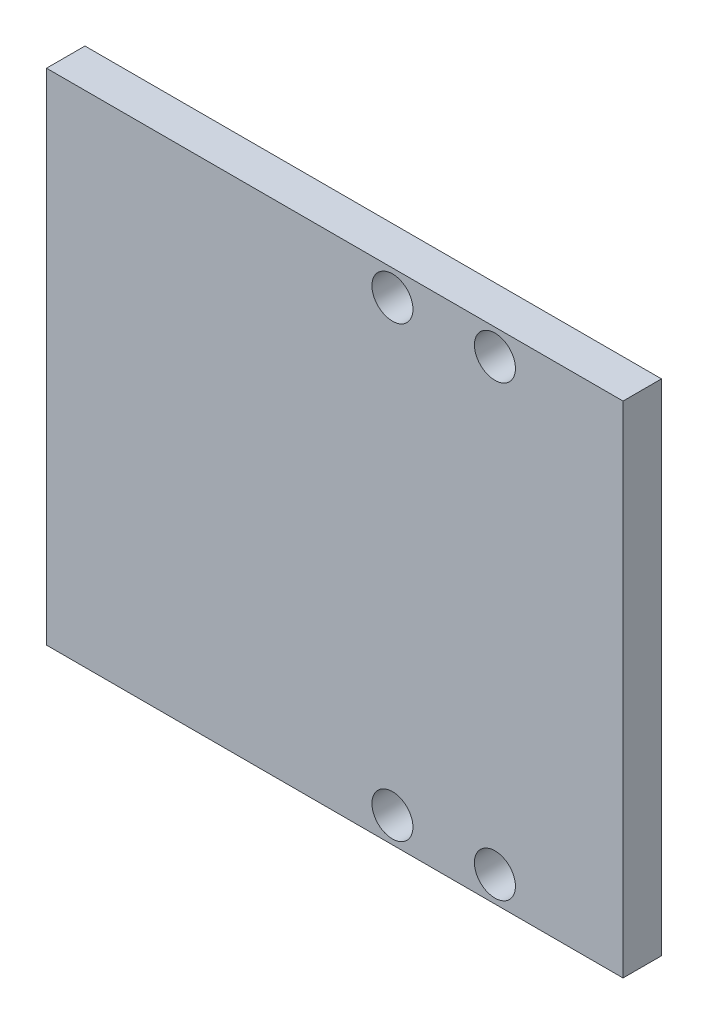
ISO-10303-21;
HEADER;
FILE_DESCRIPTION(('STEP AP214'),'2;1');
FILE_NAME('part.step','',(''),(''),'','','');
FILE_SCHEMA(('AUTOMOTIVE_DESIGN { 1 0 10303 214 1 1 1 1 }'));
ENDSEC;
DATA;
#1=APPLICATION_CONTEXT('core data for automotive mechanical design processes');
#2=APPLICATION_PROTOCOL_DEFINITION('international standard','automotive_design',2000,#1);
#3=PRODUCT_CONTEXT('',#1,'mechanical');
#4=PRODUCT('Part','Part','',(#3));
#5=PRODUCT_RELATED_PRODUCT_CATEGORY('part','',(#4));
#6=PRODUCT_DEFINITION_FORMATION('','',#4);
#7=PRODUCT_DEFINITION_CONTEXT('part definition',#1,'design');
#8=PRODUCT_DEFINITION('design','',#6,#7);
#9=PRODUCT_DEFINITION_SHAPE('','',#8);
#10=(LENGTH_UNIT() NAMED_UNIT(*) SI_UNIT(.MILLI.,.METRE.));
#11=(NAMED_UNIT(*) PLANE_ANGLE_UNIT() SI_UNIT($,.RADIAN.));
#12=(NAMED_UNIT(*) SI_UNIT($,.STERADIAN.) SOLID_ANGLE_UNIT());
#13=UNCERTAINTY_MEASURE_WITH_UNIT(LENGTH_MEASURE(1.E-05),#10,'distance_accuracy_value','');
#14=(GEOMETRIC_REPRESENTATION_CONTEXT(3) GLOBAL_UNCERTAINTY_ASSIGNED_CONTEXT((#13)) GLOBAL_UNIT_ASSIGNED_CONTEXT((#10,
#11,#12)) REPRESENTATION_CONTEXT('',''));
#15=CARTESIAN_POINT('',(0.,0.,0.));
#16=DIRECTION('',(0.,0.,1.));
#17=DIRECTION('',(1.,0.,0.));
#18=AXIS2_PLACEMENT_3D('',#15,#16,#17);
#19=CARTESIAN_POINT('',(0.,0.,3.));
#20=DIRECTION('',(0.,0.,-1.));
#21=DIRECTION('',(-1.,0.,0.));
#22=AXIS2_PLACEMENT_3D('',#19,#20,#21);
#23=PLANE('',#22);
#24=DIRECTION('',(0.,1.,0.));
#25=VECTOR('',#24,1.);
#26=CARTESIAN_POINT('',(70.,20.7624683604831,3.));
#27=LINE('',#26,#25);
#28=CARTESIAN_POINT('',(70.,-18.237468360532,3.));
#29=VERTEX_POINT('',#28);
#30=CARTESIAN_POINT('',(70.,20.7624683604831,3.));
#31=VERTEX_POINT('',#30);
#32=EDGE_CURVE('E87',#29,#31,#27,.T.);
#33=ORIENTED_EDGE('',*,*,#32,.T.);
#34=DIRECTION('',(-1.,0.,0.));
#35=VECTOR('',#34,1.);
#36=CARTESIAN_POINT('',(70.,20.7624683604831,3.));
#37=LINE('',#36,#35);
#38=CARTESIAN_POINT('',(25.,20.7624683604831,3.));
#39=VERTEX_POINT('',#38);
#40=EDGE_CURVE('E82',#31,#39,#37,.T.);
#41=ORIENTED_EDGE('',*,*,#40,.T.);
#42=DIRECTION('',(0.,-1.,0.));
#43=VECTOR('',#42,1.);
#44=CARTESIAN_POINT('',(25.,20.7624683604831,3.));
#45=LINE('',#44,#43);
#46=CARTESIAN_POINT('',(25.0000000000001,-18.237468360532,3.));
#47=VERTEX_POINT('',#46);
#48=EDGE_CURVE('E85',#39,#47,#45,.T.);
#49=ORIENTED_EDGE('',*,*,#48,.T.);
#50=DIRECTION('',(1.,0.,0.));
#51=VECTOR('',#50,1.);
#52=CARTESIAN_POINT('',(70.,-18.237468360532,3.));
#53=LINE('',#52,#51);
#54=EDGE_CURVE('E52',#47,#29,#53,.T.);
#55=ORIENTED_EDGE('',*,*,#54,.T.);
#56=EDGE_LOOP('',(#33,#41,#49,#55));
#57=FACE_BOUND('',#56,.T.);
#58=CARTESIAN_POINT('',(60.,18.7624683604831,3.));
#59=DIRECTION('',(0.,0.,1.));
#60=DIRECTION('',(1.,0.,0.));
#61=AXIS2_PLACEMENT_3D('',#58,#59,#60);
#62=CIRCLE('',#61,1.6);
#63=CARTESIAN_POINT('',(61.6,18.7624683604831,3.));
#64=VERTEX_POINT('',#63);
#65=EDGE_CURVE('E102',#64,#64,#62,.T.);
#66=ORIENTED_EDGE('',*,*,#65,.F.);
#67=EDGE_LOOP('',(#66));
#68=FACE_BOUND('',#67,.T.);
#69=CARTESIAN_POINT('',(52.,18.7624683604831,3.));
#70=DIRECTION('',(0.,0.,1.));
#71=DIRECTION('',(1.,0.,0.));
#72=AXIS2_PLACEMENT_3D('',#69,#70,#71);
#73=CIRCLE('',#72,1.6);
#74=CARTESIAN_POINT('',(53.6,18.7624683604831,3.));
#75=VERTEX_POINT('',#74);
#76=EDGE_CURVE('E117',#75,#75,#73,.T.);
#77=ORIENTED_EDGE('',*,*,#76,.F.);
#78=EDGE_LOOP('',(#77));
#79=FACE_BOUND('',#78,.T.);
#80=CARTESIAN_POINT('',(60.,-16.237468360532,3.));
#81=DIRECTION('',(0.,0.,1.));
#82=DIRECTION('',(1.,0.,0.));
#83=AXIS2_PLACEMENT_3D('',#80,#81,#82);
#84=CIRCLE('',#83,1.6);
#85=CARTESIAN_POINT('',(61.6,-16.237468360532,3.));
#86=VERTEX_POINT('',#85);
#87=EDGE_CURVE('E123',#86,#86,#84,.T.);
#88=ORIENTED_EDGE('',*,*,#87,.F.);
#89=EDGE_LOOP('',(#88));
#90=FACE_BOUND('',#89,.T.);
#91=CARTESIAN_POINT('',(52.,-16.237468360532,3.));
#92=DIRECTION('',(0.,0.,1.));
#93=DIRECTION('',(1.,0.,0.));
#94=AXIS2_PLACEMENT_3D('',#91,#92,#93);
#95=CIRCLE('',#94,1.6);
#96=CARTESIAN_POINT('',(53.6,-16.237468360532,3.));
#97=VERTEX_POINT('',#96);
#98=EDGE_CURVE('E129',#97,#97,#95,.T.);
#99=ORIENTED_EDGE('',*,*,#98,.F.);
#100=EDGE_LOOP('',(#99));
#101=FACE_BOUND('',#100,.T.);
#102=ADVANCED_FACE('F35',(#57,#68,#79,#90,#101),#23,.F.);
#103=CARTESIAN_POINT('',(0.,0.,0.));
#104=DIRECTION('',(0.,0.,-1.));
#105=DIRECTION('',(-1.,0.,0.));
#106=AXIS2_PLACEMENT_3D('',#103,#104,#105);
#107=PLANE('',#106);
#108=CARTESIAN_POINT('',(60.,-16.237468360532,0.));
#109=DIRECTION('',(0.,0.,1.));
#110=DIRECTION('',(1.,0.,0.));
#111=AXIS2_PLACEMENT_3D('',#108,#109,#110);
#112=CIRCLE('',#111,1.6);
#113=CARTESIAN_POINT('',(61.6,-16.237468360532,0.));
#114=VERTEX_POINT('',#113);
#115=EDGE_CURVE('E126',#114,#114,#112,.T.);
#116=ORIENTED_EDGE('',*,*,#115,.T.);
#117=EDGE_LOOP('',(#116));
#118=FACE_BOUND('',#117,.T.);
#119=CARTESIAN_POINT('',(60.,18.7624683604831,0.));
#120=DIRECTION('',(0.,0.,1.));
#121=DIRECTION('',(1.,0.,0.));
#122=AXIS2_PLACEMENT_3D('',#119,#120,#121);
#123=CIRCLE('',#122,1.6);
#124=CARTESIAN_POINT('',(61.6,18.7624683604831,0.));
#125=VERTEX_POINT('',#124);
#126=EDGE_CURVE('E114',#125,#125,#123,.T.);
#127=ORIENTED_EDGE('',*,*,#126,.T.);
#128=EDGE_LOOP('',(#127));
#129=FACE_BOUND('',#128,.T.);
#130=DIRECTION('',(0.,1.,0.));
#131=VECTOR('',#130,1.);
#132=CARTESIAN_POINT('',(70.,20.7624683604831,0.));
#133=LINE('',#132,#131);
#134=CARTESIAN_POINT('',(70.,-18.237468360532,0.));
#135=VERTEX_POINT('',#134);
#136=CARTESIAN_POINT('',(70.,20.7624683604831,0.));
#137=VERTEX_POINT('',#136);
#138=EDGE_CURVE('E99',#135,#137,#133,.T.);
#139=ORIENTED_EDGE('',*,*,#138,.F.);
#140=DIRECTION('',(1.,0.,0.));
#141=VECTOR('',#140,1.);
#142=CARTESIAN_POINT('',(70.,-18.237468360532,0.));
#143=LINE('',#142,#141);
#144=CARTESIAN_POINT('',(25.0000000000001,-18.237468360532,0.));
#145=VERTEX_POINT('',#144);
#146=EDGE_CURVE('E75',#145,#135,#143,.T.);
#147=ORIENTED_EDGE('',*,*,#146,.F.);
#148=DIRECTION('',(0.,-1.,0.));
#149=VECTOR('',#148,1.);
#150=CARTESIAN_POINT('',(25.,20.7624683604831,0.));
#151=LINE('',#150,#149);
#152=CARTESIAN_POINT('',(25.,20.7624683604831,0.));
#153=VERTEX_POINT('',#152);
#154=EDGE_CURVE('E69',#153,#145,#151,.T.);
#155=ORIENTED_EDGE('',*,*,#154,.F.);
#156=DIRECTION('',(-1.,0.,0.));
#157=VECTOR('',#156,1.);
#158=CARTESIAN_POINT('',(70.,20.7624683604831,0.));
#159=LINE('',#158,#157);
#160=EDGE_CURVE('E91',#137,#153,#159,.T.);
#161=ORIENTED_EDGE('',*,*,#160,.F.);
#162=EDGE_LOOP('',(#139,#147,#155,#161));
#163=FACE_BOUND('',#162,.T.);
#164=CARTESIAN_POINT('',(52.,18.7624683604831,0.));
#165=DIRECTION('',(0.,0.,1.));
#166=DIRECTION('',(1.,0.,0.));
#167=AXIS2_PLACEMENT_3D('',#164,#165,#166);
#168=CIRCLE('',#167,1.6);
#169=CARTESIAN_POINT('',(53.6,18.7624683604831,0.));
#170=VERTEX_POINT('',#169);
#171=EDGE_CURVE('E120',#170,#170,#168,.T.);
#172=ORIENTED_EDGE('',*,*,#171,.T.);
#173=EDGE_LOOP('',(#172));
#174=FACE_BOUND('',#173,.T.);
#175=CARTESIAN_POINT('',(52.,-16.237468360532,0.));
#176=DIRECTION('',(0.,0.,1.));
#177=DIRECTION('',(1.,0.,0.));
#178=AXIS2_PLACEMENT_3D('',#175,#176,#177);
#179=CIRCLE('',#178,1.6);
#180=CARTESIAN_POINT('',(53.6,-16.237468360532,0.));
#181=VERTEX_POINT('',#180);
#182=EDGE_CURVE('E132',#181,#181,#179,.T.);
#183=ORIENTED_EDGE('',*,*,#182,.T.);
#184=EDGE_LOOP('',(#183));
#185=FACE_BOUND('',#184,.T.);
#186=ADVANCED_FACE('F110',(#118,#129,#163,#174,#185),#107,.T.);
#187=CARTESIAN_POINT('',(70.,20.7624683604831,3.));
#188=DIRECTION('',(-1.,0.,0.));
#189=DIRECTION('',(0.,0.,1.));
#190=AXIS2_PLACEMENT_3D('',#187,#188,#189);
#191=PLANE('',#190);
#192=ORIENTED_EDGE('',*,*,#138,.T.);
#193=DIRECTION('',(0.,0.,-1.));
#194=VECTOR('',#193,1.);
#195=CARTESIAN_POINT('',(70.,20.7624683604831,3.));
#196=LINE('',#195,#194);
#197=EDGE_CURVE('E11',#31,#137,#196,.T.);
#198=ORIENTED_EDGE('',*,*,#197,.F.);
#199=ORIENTED_EDGE('',*,*,#32,.F.);
#200=DIRECTION('',(0.,0.,-1.));
#201=VECTOR('',#200,1.);
#202=CARTESIAN_POINT('',(70.,-18.237468360532,3.));
#203=LINE('',#202,#201);
#204=EDGE_CURVE('E95',#29,#135,#203,.T.);
#205=ORIENTED_EDGE('',*,*,#204,.T.);
#206=EDGE_LOOP('',(#192,#198,#199,#205));
#207=FACE_BOUND('',#206,.T.);
#208=ADVANCED_FACE('F37',(#207),#191,.F.);
#209=CARTESIAN_POINT('',(70.,20.7624683604831,3.));
#210=DIRECTION('',(0.,-1.,0.));
#211=DIRECTION('',(1.,0.,0.));
#212=AXIS2_PLACEMENT_3D('',#209,#210,#211);
#213=PLANE('',#212);
#214=ORIENTED_EDGE('',*,*,#160,.T.);
#215=DIRECTION('',(0.,0.,-1.));
#216=VECTOR('',#215,1.);
#217=CARTESIAN_POINT('',(25.,20.7624683604831,3.));
#218=LINE('',#217,#216);
#219=EDGE_CURVE('E44',#39,#153,#218,.T.);
#220=ORIENTED_EDGE('',*,*,#219,.F.);
#221=ORIENTED_EDGE('',*,*,#40,.F.);
#222=ORIENTED_EDGE('',*,*,#197,.T.);
#223=EDGE_LOOP('',(#214,#220,#221,#222));
#224=FACE_BOUND('',#223,.T.);
#225=ADVANCED_FACE('F90',(#224),#213,.F.);
#226=CARTESIAN_POINT('',(25.,20.7624683604831,3.));
#227=DIRECTION('',(1.,0.,0.));
#228=DIRECTION('',(0.,1.,0.));
#229=AXIS2_PLACEMENT_3D('',#226,#227,#228);
#230=PLANE('',#229);
#231=ORIENTED_EDGE('',*,*,#154,.T.);
#232=DIRECTION('',(0.,0.,-1.));
#233=VECTOR('',#232,1.);
#234=CARTESIAN_POINT('',(25.0000000000001,-18.237468360532,3.));
#235=LINE('',#234,#233);
#236=EDGE_CURVE('E92',#47,#145,#235,.T.);
#237=ORIENTED_EDGE('',*,*,#236,.F.);
#238=ORIENTED_EDGE('',*,*,#48,.F.);
#239=ORIENTED_EDGE('',*,*,#219,.T.);
#240=EDGE_LOOP('',(#231,#237,#238,#239));
#241=FACE_BOUND('',#240,.T.);
#242=ADVANCED_FACE('F93',(#241),#230,.F.);
#243=CARTESIAN_POINT('',(70.,-18.237468360532,3.));
#244=DIRECTION('',(0.,1.,0.));
#245=DIRECTION('',(-1.,0.,0.));
#246=AXIS2_PLACEMENT_3D('',#243,#244,#245);
#247=PLANE('',#246);
#248=ORIENTED_EDGE('',*,*,#146,.T.);
#249=ORIENTED_EDGE('',*,*,#204,.F.);
#250=ORIENTED_EDGE('',*,*,#54,.F.);
#251=ORIENTED_EDGE('',*,*,#236,.T.);
#252=EDGE_LOOP('',(#248,#249,#250,#251));
#253=FACE_BOUND('',#252,.T.);
#254=ADVANCED_FACE('F107',(#253),#247,.F.);
#255=CARTESIAN_POINT('',(60.,18.7624683604831,3.));
#256=DIRECTION('',(0.,0.,-1.));
#257=DIRECTION('',(-1.,0.,0.));
#258=AXIS2_PLACEMENT_3D('',#255,#256,#257);
#259=CYLINDRICAL_SURFACE('',#258,1.6);
#260=ORIENTED_EDGE('',*,*,#65,.T.);
#261=EDGE_LOOP('',(#260));
#262=FACE_BOUND('',#261,.T.);
#263=ORIENTED_EDGE('',*,*,#126,.F.);
#264=EDGE_LOOP('',(#263));
#265=FACE_BOUND('',#264,.T.);
#266=ADVANCED_FACE('F149',(#262,#265),#259,.F.);
#267=CARTESIAN_POINT('',(52.,18.7624683604831,3.));
#268=DIRECTION('',(0.,0.,-1.));
#269=DIRECTION('',(-1.,0.,0.));
#270=AXIS2_PLACEMENT_3D('',#267,#268,#269);
#271=CYLINDRICAL_SURFACE('',#270,1.6);
#272=ORIENTED_EDGE('',*,*,#76,.T.);
#273=EDGE_LOOP('',(#272));
#274=FACE_BOUND('',#273,.T.);
#275=ORIENTED_EDGE('',*,*,#171,.F.);
#276=EDGE_LOOP('',(#275));
#277=FACE_BOUND('',#276,.T.);
#278=ADVANCED_FACE('F195',(#274,#277),#271,.F.);
#279=CARTESIAN_POINT('',(60.,-16.237468360532,3.));
#280=DIRECTION('',(0.,0.,-1.));
#281=DIRECTION('',(-1.,0.,0.));
#282=AXIS2_PLACEMENT_3D('',#279,#280,#281);
#283=CYLINDRICAL_SURFACE('',#282,1.6);
#284=ORIENTED_EDGE('',*,*,#87,.T.);
#285=EDGE_LOOP('',(#284));
#286=FACE_BOUND('',#285,.T.);
#287=ORIENTED_EDGE('',*,*,#115,.F.);
#288=EDGE_LOOP('',(#287));
#289=FACE_BOUND('',#288,.T.);
#290=ADVANCED_FACE('F203',(#286,#289),#283,.F.);
#291=CARTESIAN_POINT('',(52.,-16.237468360532,3.));
#292=DIRECTION('',(0.,0.,-1.));
#293=DIRECTION('',(-1.,0.,0.));
#294=AXIS2_PLACEMENT_3D('',#291,#292,#293);
#295=CYLINDRICAL_SURFACE('',#294,1.6);
#296=ORIENTED_EDGE('',*,*,#98,.T.);
#297=EDGE_LOOP('',(#296));
#298=FACE_BOUND('',#297,.T.);
#299=ORIENTED_EDGE('',*,*,#182,.F.);
#300=EDGE_LOOP('',(#299));
#301=FACE_BOUND('',#300,.T.);
#302=ADVANCED_FACE('F138',(#298,#301),#295,.F.);
#303=CLOSED_SHELL('',(#102,#186,#208,#225,#242,#254,#266,#278,#290,#302));
#304=MANIFOLD_SOLID_BREP('B2',#303);
#305=ADVANCED_BREP_SHAPE_REPRESENTATION('',(#18,#304),#14);
#306=SHAPE_DEFINITION_REPRESENTATION(#9,#305);
ENDSEC;
END-ISO-10303-21;
